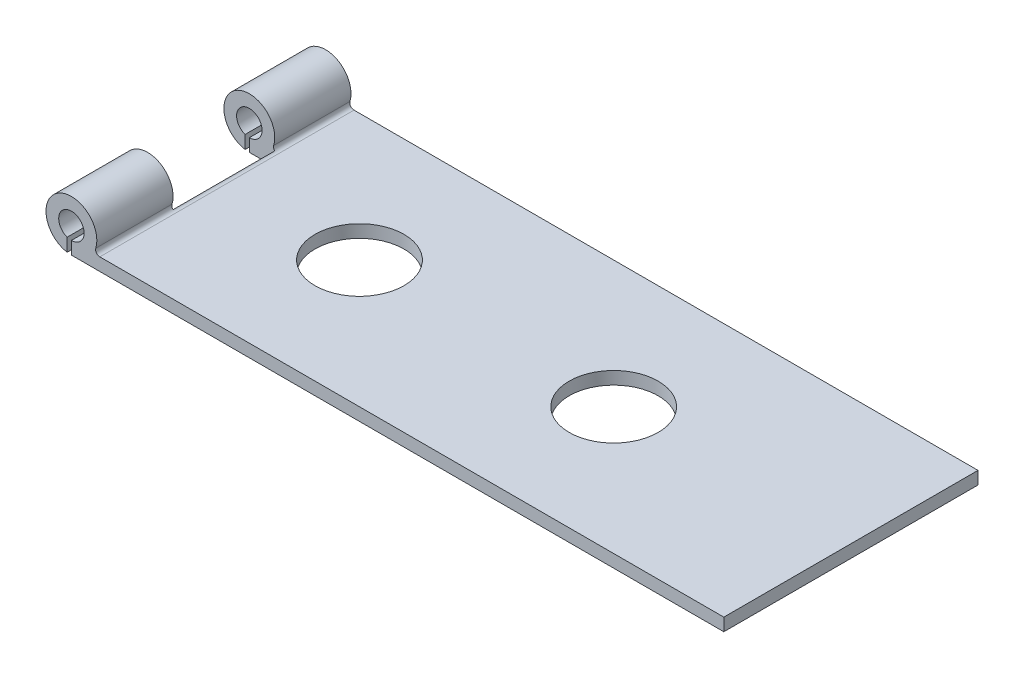
ISO-10303-21;
HEADER;
FILE_DESCRIPTION(('STEP AP214'),'2;1');
FILE_NAME('part.step','',(''),(''),'','','');
FILE_SCHEMA(('AUTOMOTIVE_DESIGN { 1 0 10303 214 1 1 1 1 }'));
ENDSEC;
DATA;
#1=APPLICATION_CONTEXT('core data for automotive mechanical design processes');
#2=APPLICATION_PROTOCOL_DEFINITION('international standard','automotive_design',2000,#1);
#3=PRODUCT_CONTEXT('',#1,'mechanical');
#4=PRODUCT('Part','Part','',(#3));
#5=PRODUCT_RELATED_PRODUCT_CATEGORY('part','',(#4));
#6=PRODUCT_DEFINITION_FORMATION('','',#4);
#7=PRODUCT_DEFINITION_CONTEXT('part definition',#1,'design');
#8=PRODUCT_DEFINITION('design','',#6,#7);
#9=PRODUCT_DEFINITION_SHAPE('','',#8);
#10=(LENGTH_UNIT() NAMED_UNIT(*) SI_UNIT(.MILLI.,.METRE.));
#11=(NAMED_UNIT(*) PLANE_ANGLE_UNIT() SI_UNIT($,.RADIAN.));
#12=(NAMED_UNIT(*) SI_UNIT($,.STERADIAN.) SOLID_ANGLE_UNIT());
#13=UNCERTAINTY_MEASURE_WITH_UNIT(LENGTH_MEASURE(1.E-05),#10,'distance_accuracy_value','');
#14=(GEOMETRIC_REPRESENTATION_CONTEXT(3) GLOBAL_UNCERTAINTY_ASSIGNED_CONTEXT((#13)) GLOBAL_UNIT_ASSIGNED_CONTEXT((#10,
#11,#12)) REPRESENTATION_CONTEXT('',''));
#15=CARTESIAN_POINT('',(0.,0.,0.));
#16=DIRECTION('',(0.,0.,1.));
#17=DIRECTION('',(1.,0.,0.));
#18=AXIS2_PLACEMENT_3D('',#15,#16,#17);
#19=CARTESIAN_POINT('',(0.,0.,15.));
#20=DIRECTION('',(0.,0.,-1.));
#21=DIRECTION('',(-1.,0.,0.));
#22=AXIS2_PLACEMENT_3D('',#19,#20,#21);
#23=CYLINDRICAL_SURFACE('',#22,3.);
#24=CARTESIAN_POINT('',(0.,0.,6.));
#25=DIRECTION('',(0.,0.,1.));
#26=DIRECTION('',(1.,0.,0.));
#27=AXIS2_PLACEMENT_3D('',#24,#25,#26);
#28=CIRCLE('',#27,3.);
#29=CARTESIAN_POINT('',(2.87494454249973,-0.857142857142859,6.));
#30=VERTEX_POINT('',#29);
#31=CARTESIAN_POINT('',(-0.5,-2.95803989154981,6.));
#32=VERTEX_POINT('',#31);
#33=EDGE_CURVE('E179',#30,#32,#28,.T.);
#34=ORIENTED_EDGE('',*,*,#33,.T.);
#35=DIRECTION('',(0.,0.,-1.));
#36=VECTOR('',#35,1.);
#37=CARTESIAN_POINT('',(-0.5,-2.95803989154981,15.));
#38=LINE('',#37,#36);
#39=CARTESIAN_POINT('',(-0.5,-2.95803989154981,15.));
#40=VERTEX_POINT('',#39);
#41=EDGE_CURVE('E56',#32,#40,#38,.F.);
#42=ORIENTED_EDGE('',*,*,#41,.T.);
#43=CARTESIAN_POINT('',(0.,0.,15.));
#44=DIRECTION('',(0.,0.,1.));
#45=DIRECTION('',(1.,0.,0.));
#46=AXIS2_PLACEMENT_3D('',#43,#44,#45);
#47=CIRCLE('',#46,3.);
#48=CARTESIAN_POINT('',(2.87494454249973,-0.857142857142859,15.));
#49=VERTEX_POINT('',#48);
#50=EDGE_CURVE('E185',#49,#40,#47,.T.);
#51=ORIENTED_EDGE('',*,*,#50,.F.);
#52=DIRECTION('',(0.,0.,-1.));
#53=VECTOR('',#52,1.);
#54=CARTESIAN_POINT('',(2.87494454249973,-0.857142857142859,15.));
#55=LINE('',#54,#53);
#56=EDGE_CURVE('E218',#49,#30,#55,.T.);
#57=ORIENTED_EDGE('',*,*,#56,.T.);
#58=EDGE_LOOP('',(#34,#42,#51,#57));
#59=FACE_BOUND('',#58,.T.);
#60=ADVANCED_FACE('F39',(#59),#23,.T.);
#61=CARTESIAN_POINT('',(0.,0.,15.));
#62=DIRECTION('',(0.,0.,-1.));
#63=DIRECTION('',(-1.,0.,0.));
#64=AXIS2_PLACEMENT_3D('',#61,#62,#63);
#65=CYLINDRICAL_SURFACE('',#64,1.5);
#66=DIRECTION('',(0.,0.,-1.));
#67=VECTOR('',#66,1.);
#68=CARTESIAN_POINT('',(0.,-1.5,15.));
#69=LINE('',#68,#67);
#70=CARTESIAN_POINT('',(0.,-1.5,15.));
#71=VERTEX_POINT('',#70);
#72=CARTESIAN_POINT('',(0.,-1.5,6.));
#73=VERTEX_POINT('',#72);
#74=EDGE_CURVE('E64',#71,#73,#69,.T.);
#75=ORIENTED_EDGE('',*,*,#74,.F.);
#76=CARTESIAN_POINT('',(0.,0.,15.));
#77=DIRECTION('',(0.,0.,1.));
#78=DIRECTION('',(1.,0.,0.));
#79=AXIS2_PLACEMENT_3D('',#76,#77,#78);
#80=CIRCLE('',#79,1.5);
#81=CARTESIAN_POINT('',(-0.5,-1.4142135623731,15.));
#82=VERTEX_POINT('',#81);
#83=EDGE_CURVE('E172',#71,#82,#80,.T.);
#84=ORIENTED_EDGE('',*,*,#83,.T.);
#85=DIRECTION('',(0.,0.,-1.));
#86=VECTOR('',#85,1.);
#87=CARTESIAN_POINT('',(-0.5,-1.4142135623731,15.));
#88=LINE('',#87,#86);
#89=CARTESIAN_POINT('',(-0.5,-1.4142135623731,6.));
#90=VERTEX_POINT('',#89);
#91=EDGE_CURVE('E247',#90,#82,#88,.F.);
#92=ORIENTED_EDGE('',*,*,#91,.F.);
#93=CARTESIAN_POINT('',(0.,0.,6.));
#94=DIRECTION('',(0.,0.,1.));
#95=DIRECTION('',(1.,0.,0.));
#96=AXIS2_PLACEMENT_3D('',#93,#94,#95);
#97=CIRCLE('',#96,1.5);
#98=EDGE_CURVE('E224',#73,#90,#97,.T.);
#99=ORIENTED_EDGE('',*,*,#98,.F.);
#100=EDGE_LOOP('',(#75,#84,#92,#99));
#101=FACE_BOUND('',#100,.T.);
#102=ADVANCED_FACE('F316',(#101),#65,.F.);
#103=CARTESIAN_POINT('',(3.35410196624968,-1.,15.));
#104=DIRECTION('',(0.,0.,1.));
#105=DIRECTION('',(1.,0.,0.));
#106=AXIS2_PLACEMENT_3D('',#103,#104,#105);
#107=PLANE('',#106);
#108=DIRECTION('',(0.,1.,0.));
#109=VECTOR('',#108,1.);
#110=CARTESIAN_POINT('',(0.,-1.,15.));
#111=LINE('',#110,#109);
#112=CARTESIAN_POINT('',(0.,-3.,15.));
#113=VERTEX_POINT('',#112);
#114=EDGE_CURVE('E256',#113,#71,#111,.T.);
#115=ORIENTED_EDGE('',*,*,#114,.F.);
#116=DIRECTION('',(1.,0.,0.));
#117=VECTOR('',#116,1.);
#118=CARTESIAN_POINT('',(0.,-3.,15.));
#119=LINE('',#118,#117);
#120=CARTESIAN_POINT('',(77.,-3.,15.));
#121=VERTEX_POINT('',#120);
#122=EDGE_CURVE('E189',#113,#121,#119,.T.);
#123=ORIENTED_EDGE('',*,*,#122,.T.);
#124=DIRECTION('',(0.,1.,0.));
#125=VECTOR('',#124,1.);
#126=CARTESIAN_POINT('',(77.,-3.,15.));
#127=LINE('',#126,#125);
#128=CARTESIAN_POINT('',(77.,-1.5,15.));
#129=VERTEX_POINT('',#128);
#130=EDGE_CURVE('E191',#121,#129,#127,.T.);
#131=ORIENTED_EDGE('',*,*,#130,.T.);
#132=DIRECTION('',(-1.,0.,0.));
#133=VECTOR('',#132,1.);
#134=CARTESIAN_POINT('',(3.35410196624968,-1.5,15.));
#135=LINE('',#134,#133);
#136=CARTESIAN_POINT('',(3.35410196624968,-1.5,15.));
#137=VERTEX_POINT('',#136);
#138=EDGE_CURVE('E193',#129,#137,#135,.T.);
#139=ORIENTED_EDGE('',*,*,#138,.T.);
#140=CARTESIAN_POINT('',(3.35410196624968,-1.,15.));
#141=DIRECTION('',(0.,0.,-1.));
#142=DIRECTION('',(1.,0.,0.));
#143=AXIS2_PLACEMENT_3D('',#140,#141,#142);
#144=CIRCLE('',#143,0.5);
#145=EDGE_CURVE('E182',#137,#49,#144,.T.);
#146=ORIENTED_EDGE('',*,*,#145,.T.);
#147=ORIENTED_EDGE('',*,*,#50,.T.);
#148=DIRECTION('',(0.,-1.,0.));
#149=VECTOR('',#148,1.);
#150=CARTESIAN_POINT('',(-0.5,-1.,15.));
#151=LINE('',#150,#149);
#152=EDGE_CURVE('E250',#82,#40,#151,.T.);
#153=ORIENTED_EDGE('',*,*,#152,.F.);
#154=ORIENTED_EDGE('',*,*,#83,.F.);
#155=EDGE_LOOP('',(#115,#123,#131,#139,#146,#147,#153,#154));
#156=FACE_BOUND('',#155,.T.);
#157=ADVANCED_FACE('F287',(#156),#107,.T.);
#158=CARTESIAN_POINT('',(3.35410196624968,-1.,-15.));
#159=DIRECTION('',(0.,0.,1.));
#160=DIRECTION('',(1.,0.,0.));
#161=AXIS2_PLACEMENT_3D('',#158,#159,#160);
#162=PLANE('',#161);
#163=DIRECTION('',(1.,0.,0.));
#164=VECTOR('',#163,1.);
#165=CARTESIAN_POINT('',(0.,-3.,-15.));
#166=LINE('',#165,#164);
#167=CARTESIAN_POINT('',(0.,-3.,-15.));
#168=VERTEX_POINT('',#167);
#169=CARTESIAN_POINT('',(77.,-3.,-15.));
#170=VERTEX_POINT('',#169);
#171=EDGE_CURVE('E200',#168,#170,#166,.T.);
#172=ORIENTED_EDGE('',*,*,#171,.F.);
#173=DIRECTION('',(0.,1.,0.));
#174=VECTOR('',#173,1.);
#175=CARTESIAN_POINT('',(0.,0.,-15.));
#176=LINE('',#175,#174);
#177=CARTESIAN_POINT('',(0.,-1.5,-15.));
#178=VERTEX_POINT('',#177);
#179=EDGE_CURVE('E158',#168,#178,#176,.T.);
#180=ORIENTED_EDGE('',*,*,#179,.T.);
#181=CARTESIAN_POINT('',(0.,0.,-15.));
#182=DIRECTION('',(0.,0.,1.));
#183=DIRECTION('',(1.,0.,0.));
#184=AXIS2_PLACEMENT_3D('',#181,#182,#183);
#185=CIRCLE('',#184,1.5);
#186=CARTESIAN_POINT('',(-0.5,-1.4142135623731,-15.));
#187=VERTEX_POINT('',#186);
#188=EDGE_CURVE('E165',#178,#187,#185,.T.);
#189=ORIENTED_EDGE('',*,*,#188,.T.);
#190=DIRECTION('',(0.,-1.,0.));
#191=VECTOR('',#190,1.);
#192=CARTESIAN_POINT('',(-0.5,0.,-15.));
#193=LINE('',#192,#191);
#194=CARTESIAN_POINT('',(-0.5,-2.95803989154981,-15.));
#195=VERTEX_POINT('',#194);
#196=EDGE_CURVE('E147',#187,#195,#193,.T.);
#197=ORIENTED_EDGE('',*,*,#196,.T.);
#198=CARTESIAN_POINT('',(0.,0.,-15.));
#199=DIRECTION('',(0.,0.,1.));
#200=DIRECTION('',(1.,0.,0.));
#201=AXIS2_PLACEMENT_3D('',#198,#199,#200);
#202=CIRCLE('',#201,3.);
#203=CARTESIAN_POINT('',(2.87494454249973,-0.857142857142859,-15.));
#204=VERTEX_POINT('',#203);
#205=EDGE_CURVE('E198',#204,#195,#202,.T.);
#206=ORIENTED_EDGE('',*,*,#205,.F.);
#207=CARTESIAN_POINT('',(3.35410196624968,-1.,-15.));
#208=DIRECTION('',(0.,0.,-1.));
#209=DIRECTION('',(1.,0.,0.));
#210=AXIS2_PLACEMENT_3D('',#207,#208,#209);
#211=CIRCLE('',#210,0.5);
#212=CARTESIAN_POINT('',(3.35410196624968,-1.5,-15.));
#213=VERTEX_POINT('',#212);
#214=EDGE_CURVE('E176',#213,#204,#211,.T.);
#215=ORIENTED_EDGE('',*,*,#214,.F.);
#216=DIRECTION('',(-1.,0.,0.));
#217=VECTOR('',#216,1.);
#218=CARTESIAN_POINT('',(3.35410196624968,-1.5,-15.));
#219=LINE('',#218,#217);
#220=CARTESIAN_POINT('',(77.,-1.5,-15.));
#221=VERTEX_POINT('',#220);
#222=EDGE_CURVE('E186',#221,#213,#219,.T.);
#223=ORIENTED_EDGE('',*,*,#222,.F.);
#224=DIRECTION('',(0.,1.,0.));
#225=VECTOR('',#224,1.);
#226=CARTESIAN_POINT('',(77.,-3.,-15.));
#227=LINE('',#226,#225);
#228=EDGE_CURVE('E202',#170,#221,#227,.T.);
#229=ORIENTED_EDGE('',*,*,#228,.F.);
#230=EDGE_LOOP('',(#172,#180,#189,#197,#206,#215,#223,#229));
#231=FACE_BOUND('',#230,.T.);
#232=ADVANCED_FACE('F171',(#231),#162,.F.);
#233=CARTESIAN_POINT('',(3.35410196624968,-1.,15.));
#234=DIRECTION('',(0.,0.,-1.));
#235=DIRECTION('',(-1.,0.,0.));
#236=AXIS2_PLACEMENT_3D('',#233,#234,#235);
#237=CYLINDRICAL_SURFACE('',#236,0.5);
#238=DIRECTION('',(0.,0.,-1.));
#239=VECTOR('',#238,1.);
#240=CARTESIAN_POINT('',(3.,-1.35300396243967,15.));
#241=LINE('',#240,#239);
#242=CARTESIAN_POINT('',(3.,-1.35300396243967,-6.));
#243=VERTEX_POINT('',#242);
#244=CARTESIAN_POINT('',(3.,-1.35300396243967,6.));
#245=VERTEX_POINT('',#244);
#246=EDGE_CURVE('E173',#243,#245,#241,.F.);
#247=ORIENTED_EDGE('',*,*,#246,.T.);
#248=CARTESIAN_POINT('',(3.35410196624968,-1.,6.));
#249=DIRECTION('',(0.,0.,1.));
#250=DIRECTION('',(1.,0.,0.));
#251=AXIS2_PLACEMENT_3D('',#248,#249,#250);
#252=CIRCLE('',#251,0.5);
#253=EDGE_CURVE('E227',#245,#30,#252,.F.);
#254=ORIENTED_EDGE('',*,*,#253,.T.);
#255=ORIENTED_EDGE('',*,*,#56,.F.);
#256=ORIENTED_EDGE('',*,*,#145,.F.);
#257=DIRECTION('',(0.,0.,-1.));
#258=VECTOR('',#257,1.);
#259=CARTESIAN_POINT('',(3.35410196624968,-1.5,15.));
#260=LINE('',#259,#258);
#261=EDGE_CURVE('E195',#137,#213,#260,.T.);
#262=ORIENTED_EDGE('',*,*,#261,.T.);
#263=ORIENTED_EDGE('',*,*,#214,.T.);
#264=CARTESIAN_POINT('',(2.87494454249973,-0.857142857142859,-6.));
#265=VERTEX_POINT('',#264);
#266=EDGE_CURVE('E217',#265,#204,#55,.T.);
#267=ORIENTED_EDGE('',*,*,#266,.F.);
#268=CARTESIAN_POINT('',(3.35410196624968,-1.,-6.));
#269=DIRECTION('',(0.,0.,-1.));
#270=DIRECTION('',(-1.,0.,0.));
#271=AXIS2_PLACEMENT_3D('',#268,#269,#270);
#272=CIRCLE('',#271,0.5);
#273=EDGE_CURVE('E228',#265,#243,#272,.F.);
#274=ORIENTED_EDGE('',*,*,#273,.T.);
#275=EDGE_LOOP('',(#247,#254,#255,#256,#262,#263,#267,#274));
#276=FACE_BOUND('',#275,.T.);
#277=ADVANCED_FACE('F41',(#276),#237,.F.);
#278=ORIENTED_EDGE('',*,*,#205,.T.);
#279=DIRECTION('',(0.,0.,-1.));
#280=VECTOR('',#279,1.);
#281=CARTESIAN_POINT('',(-0.5,-2.95803989154981,15.));
#282=LINE('',#281,#280);
#283=CARTESIAN_POINT('',(-0.5,-2.95803989154981,-6.));
#284=VERTEX_POINT('',#283);
#285=EDGE_CURVE('E153',#195,#284,#282,.F.);
#286=ORIENTED_EDGE('',*,*,#285,.T.);
#287=CARTESIAN_POINT('',(0.,0.,-6.));
#288=DIRECTION('',(0.,0.,-1.));
#289=DIRECTION('',(-1.,0.,0.));
#290=AXIS2_PLACEMENT_3D('',#287,#288,#289);
#291=CIRCLE('',#290,3.);
#292=EDGE_CURVE('E222',#284,#265,#291,.T.);
#293=ORIENTED_EDGE('',*,*,#292,.T.);
#294=ORIENTED_EDGE('',*,*,#266,.T.);
#295=EDGE_LOOP('',(#278,#286,#293,#294));
#296=FACE_BOUND('',#295,.T.);
#297=ADVANCED_FACE('F296',(#296),#23,.T.);
#298=CARTESIAN_POINT('',(0.,-3.,15.));
#299=DIRECTION('',(0.,1.,0.));
#300=DIRECTION('',(0.,0.,1.));
#301=AXIS2_PLACEMENT_3D('',#298,#299,#300);
#302=PLANE('',#301);
#303=CARTESIAN_POINT('',(19.,-3.,0.));
#304=DIRECTION('',(0.,1.,0.));
#305=DIRECTION('',(0.,0.,1.));
#306=AXIS2_PLACEMENT_3D('',#303,#304,#305);
#307=CIRCLE('',#306,5.25);
#308=CARTESIAN_POINT('',(19.,-3.,5.25));
#309=VERTEX_POINT('',#308);
#310=EDGE_CURVE('E231',#309,#309,#307,.T.);
#311=ORIENTED_EDGE('',*,*,#310,.T.);
#312=EDGE_LOOP('',(#311));
#313=FACE_BOUND('',#312,.T.);
#314=CARTESIAN_POINT('',(49.,-3.,0.));
#315=DIRECTION('',(0.,1.,0.));
#316=DIRECTION('',(0.,0.,1.));
#317=AXIS2_PLACEMENT_3D('',#314,#315,#316);
#318=CIRCLE('',#317,5.25);
#319=CARTESIAN_POINT('',(49.,-3.,5.25));
#320=VERTEX_POINT('',#319);
#321=EDGE_CURVE('E236',#320,#320,#318,.T.);
#322=ORIENTED_EDGE('',*,*,#321,.T.);
#323=EDGE_LOOP('',(#322));
#324=FACE_BOUND('',#323,.T.);
#325=DIRECTION('',(0.,0.,-1.));
#326=VECTOR('',#325,1.);
#327=CARTESIAN_POINT('',(0.,-3.,15.));
#328=LINE('',#327,#326);
#329=CARTESIAN_POINT('',(0.,-3.,6.));
#330=VERTEX_POINT('',#329);
#331=EDGE_CURVE('E214',#113,#330,#328,.T.);
#332=ORIENTED_EDGE('',*,*,#331,.T.);
#333=DIRECTION('',(1.,0.,0.));
#334=VECTOR('',#333,1.);
#335=CARTESIAN_POINT('',(-3.,-3.,6.));
#336=LINE('',#335,#334);
#337=CARTESIAN_POINT('',(3.,-3.,6.));
#338=VERTEX_POINT('',#337);
#339=EDGE_CURVE('E265',#330,#338,#336,.T.);
#340=ORIENTED_EDGE('',*,*,#339,.T.);
#341=DIRECTION('',(0.,0.,-1.));
#342=VECTOR('',#341,1.);
#343=CARTESIAN_POINT('',(3.,-3.,6.));
#344=LINE('',#343,#342);
#345=CARTESIAN_POINT('',(3.,-3.,-6.));
#346=VERTEX_POINT('',#345);
#347=EDGE_CURVE('E259',#338,#346,#344,.T.);
#348=ORIENTED_EDGE('',*,*,#347,.T.);
#349=DIRECTION('',(-1.,0.,0.));
#350=VECTOR('',#349,1.);
#351=CARTESIAN_POINT('',(-3.,-3.,-6.));
#352=LINE('',#351,#350);
#353=CARTESIAN_POINT('',(0.,-3.,-6.));
#354=VERTEX_POINT('',#353);
#355=EDGE_CURVE('E262',#346,#354,#352,.T.);
#356=ORIENTED_EDGE('',*,*,#355,.T.);
#357=EDGE_CURVE('E213',#354,#168,#328,.T.);
#358=ORIENTED_EDGE('',*,*,#357,.T.);
#359=ORIENTED_EDGE('',*,*,#171,.T.);
#360=DIRECTION('',(0.,0.,-1.));
#361=VECTOR('',#360,1.);
#362=CARTESIAN_POINT('',(77.,-3.,15.));
#363=LINE('',#362,#361);
#364=EDGE_CURVE('E210',#121,#170,#363,.T.);
#365=ORIENTED_EDGE('',*,*,#364,.F.);
#366=ORIENTED_EDGE('',*,*,#122,.F.);
#367=EDGE_LOOP('',(#332,#340,#348,#356,#358,#359,#365,#366));
#368=FACE_BOUND('',#367,.T.);
#369=ADVANCED_FACE('F310',(#313,#324,#368),#302,.F.);
#370=CARTESIAN_POINT('',(77.,-3.,15.));
#371=DIRECTION('',(-1.,0.,0.));
#372=DIRECTION('',(0.,0.,1.));
#373=AXIS2_PLACEMENT_3D('',#370,#371,#372);
#374=PLANE('',#373);
#375=ORIENTED_EDGE('',*,*,#228,.T.);
#376=DIRECTION('',(0.,0.,-1.));
#377=VECTOR('',#376,1.);
#378=CARTESIAN_POINT('',(77.,-1.5,15.));
#379=LINE('',#378,#377);
#380=EDGE_CURVE('E207',#129,#221,#379,.T.);
#381=ORIENTED_EDGE('',*,*,#380,.F.);
#382=ORIENTED_EDGE('',*,*,#130,.F.);
#383=ORIENTED_EDGE('',*,*,#364,.T.);
#384=EDGE_LOOP('',(#375,#381,#382,#383));
#385=FACE_BOUND('',#384,.T.);
#386=ADVANCED_FACE('F343',(#385),#374,.F.);
#387=CARTESIAN_POINT('',(3.35410196624968,-1.5,15.));
#388=DIRECTION('',(0.,-1.,0.));
#389=DIRECTION('',(0.,0.,-1.));
#390=AXIS2_PLACEMENT_3D('',#387,#388,#389);
#391=PLANE('',#390);
#392=CARTESIAN_POINT('',(19.,-1.5,0.));
#393=DIRECTION('',(0.,-1.,0.));
#394=DIRECTION('',(0.,0.,-1.));
#395=AXIS2_PLACEMENT_3D('',#392,#393,#394);
#396=CIRCLE('',#395,5.25);
#397=CARTESIAN_POINT('',(19.,-1.5,-5.25));
#398=VERTEX_POINT('',#397);
#399=EDGE_CURVE('E43',#398,#398,#396,.T.);
#400=ORIENTED_EDGE('',*,*,#399,.T.);
#401=EDGE_LOOP('',(#400));
#402=FACE_BOUND('',#401,.T.);
#403=CARTESIAN_POINT('',(49.,-1.5,0.));
#404=DIRECTION('',(0.,-1.,0.));
#405=DIRECTION('',(0.,0.,-1.));
#406=AXIS2_PLACEMENT_3D('',#403,#404,#405);
#407=CIRCLE('',#406,5.25);
#408=CARTESIAN_POINT('',(49.,-1.5,-5.25));
#409=VERTEX_POINT('',#408);
#410=EDGE_CURVE('E229',#409,#409,#407,.T.);
#411=ORIENTED_EDGE('',*,*,#410,.T.);
#412=EDGE_LOOP('',(#411));
#413=FACE_BOUND('',#412,.T.);
#414=ORIENTED_EDGE('',*,*,#222,.T.);
#415=ORIENTED_EDGE('',*,*,#261,.F.);
#416=ORIENTED_EDGE('',*,*,#138,.F.);
#417=ORIENTED_EDGE('',*,*,#380,.T.);
#418=EDGE_LOOP('',(#414,#415,#416,#417));
#419=FACE_BOUND('',#418,.T.);
#420=ADVANCED_FACE('F354',(#402,#413,#419),#391,.F.);
#421=DIRECTION('',(0.,0.,-1.));
#422=VECTOR('',#421,1.);
#423=CARTESIAN_POINT('',(0.,-1.5,15.));
#424=LINE('',#423,#422);
#425=CARTESIAN_POINT('',(0.,-1.5,-6.));
#426=VERTEX_POINT('',#425);
#427=EDGE_CURVE('E252',#426,#178,#424,.T.);
#428=ORIENTED_EDGE('',*,*,#427,.F.);
#429=CARTESIAN_POINT('',(0.,0.,-6.));
#430=DIRECTION('',(0.,0.,-1.));
#431=DIRECTION('',(-1.,0.,0.));
#432=AXIS2_PLACEMENT_3D('',#429,#430,#431);
#433=CIRCLE('',#432,1.5);
#434=CARTESIAN_POINT('',(-0.5,-1.4142135623731,-6.));
#435=VERTEX_POINT('',#434);
#436=EDGE_CURVE('E167',#435,#426,#433,.T.);
#437=ORIENTED_EDGE('',*,*,#436,.F.);
#438=DIRECTION('',(0.,0.,-1.));
#439=VECTOR('',#438,1.);
#440=CARTESIAN_POINT('',(-0.5,-1.4142135623731,15.));
#441=LINE('',#440,#439);
#442=EDGE_CURVE('E150',#187,#435,#441,.F.);
#443=ORIENTED_EDGE('',*,*,#442,.F.);
#444=ORIENTED_EDGE('',*,*,#188,.F.);
#445=EDGE_LOOP('',(#428,#437,#443,#444));
#446=FACE_BOUND('',#445,.T.);
#447=ADVANCED_FACE('F164',(#446),#65,.F.);
#448=CARTESIAN_POINT('',(3.,-3.,6.));
#449=DIRECTION('',(1.,0.,0.));
#450=DIRECTION('',(0.,0.,-1.));
#451=AXIS2_PLACEMENT_3D('',#448,#449,#450);
#452=PLANE('',#451);
#453=DIRECTION('',(0.,1.,0.));
#454=VECTOR('',#453,1.);
#455=CARTESIAN_POINT('',(3.,-3.,-6.));
#456=LINE('',#455,#454);
#457=EDGE_CURVE('E268',#346,#243,#456,.T.);
#458=ORIENTED_EDGE('',*,*,#457,.F.);
#459=ORIENTED_EDGE('',*,*,#347,.F.);
#460=DIRECTION('',(0.,1.,0.));
#461=VECTOR('',#460,1.);
#462=CARTESIAN_POINT('',(3.,-3.,6.));
#463=LINE('',#462,#461);
#464=EDGE_CURVE('E223',#338,#245,#463,.T.);
#465=ORIENTED_EDGE('',*,*,#464,.T.);
#466=ORIENTED_EDGE('',*,*,#246,.F.);
#467=EDGE_LOOP('',(#458,#459,#465,#466));
#468=FACE_BOUND('',#467,.T.);
#469=ADVANCED_FACE('F304',(#468),#452,.F.);
#470=CARTESIAN_POINT('',(-3.,-3.,6.));
#471=DIRECTION('',(0.,0.,1.));
#472=DIRECTION('',(1.,0.,0.));
#473=AXIS2_PLACEMENT_3D('',#470,#471,#472);
#474=PLANE('',#473);
#475=ORIENTED_EDGE('',*,*,#339,.F.);
#476=DIRECTION('',(0.,1.,0.));
#477=VECTOR('',#476,1.);
#478=CARTESIAN_POINT('',(0.,-3.,6.));
#479=LINE('',#478,#477);
#480=EDGE_CURVE('E254',#330,#73,#479,.T.);
#481=ORIENTED_EDGE('',*,*,#480,.T.);
#482=ORIENTED_EDGE('',*,*,#98,.T.);
#483=DIRECTION('',(0.,-1.,0.));
#484=VECTOR('',#483,1.);
#485=CARTESIAN_POINT('',(-0.5,-3.,6.));
#486=LINE('',#485,#484);
#487=EDGE_CURVE('E245',#90,#32,#486,.T.);
#488=ORIENTED_EDGE('',*,*,#487,.T.);
#489=ORIENTED_EDGE('',*,*,#33,.F.);
#490=ORIENTED_EDGE('',*,*,#253,.F.);
#491=ORIENTED_EDGE('',*,*,#464,.F.);
#492=EDGE_LOOP('',(#475,#481,#482,#488,#489,#490,#491));
#493=FACE_BOUND('',#492,.T.);
#494=ADVANCED_FACE('F306',(#493),#474,.F.);
#495=CARTESIAN_POINT('',(-3.,-3.,-6.));
#496=DIRECTION('',(0.,0.,-1.));
#497=DIRECTION('',(-1.,0.,0.));
#498=AXIS2_PLACEMENT_3D('',#495,#496,#497);
#499=PLANE('',#498);
#500=ORIENTED_EDGE('',*,*,#436,.T.);
#501=DIRECTION('',(0.,-1.,0.));
#502=VECTOR('',#501,1.);
#503=CARTESIAN_POINT('',(0.,-3.,-6.));
#504=LINE('',#503,#502);
#505=EDGE_CURVE('E11',#426,#354,#504,.T.);
#506=ORIENTED_EDGE('',*,*,#505,.T.);
#507=ORIENTED_EDGE('',*,*,#355,.F.);
#508=ORIENTED_EDGE('',*,*,#457,.T.);
#509=ORIENTED_EDGE('',*,*,#273,.F.);
#510=ORIENTED_EDGE('',*,*,#292,.F.);
#511=DIRECTION('',(0.,1.,0.));
#512=VECTOR('',#511,1.);
#513=CARTESIAN_POINT('',(-0.5,-3.,-6.));
#514=LINE('',#513,#512);
#515=EDGE_CURVE('E48',#284,#435,#514,.T.);
#516=ORIENTED_EDGE('',*,*,#515,.T.);
#517=EDGE_LOOP('',(#500,#506,#507,#508,#509,#510,#516));
#518=FACE_BOUND('',#517,.T.);
#519=ADVANCED_FACE('F300',(#518),#499,.F.);
#520=CARTESIAN_POINT('',(-0.5,0.,-15.));
#521=DIRECTION('',(-1.,0.,0.));
#522=DIRECTION('',(0.,0.,1.));
#523=AXIS2_PLACEMENT_3D('',#520,#521,#522);
#524=PLANE('',#523);
#525=ORIENTED_EDGE('',*,*,#196,.F.);
#526=ORIENTED_EDGE('',*,*,#442,.T.);
#527=ORIENTED_EDGE('',*,*,#515,.F.);
#528=ORIENTED_EDGE('',*,*,#285,.F.);
#529=EDGE_LOOP('',(#525,#526,#527,#528));
#530=FACE_BOUND('',#529,.T.);
#531=ADVANCED_FACE('F149',(#530),#524,.F.);
#532=CARTESIAN_POINT('',(0.,0.,-15.));
#533=DIRECTION('',(1.,0.,0.));
#534=DIRECTION('',(0.,0.,-1.));
#535=AXIS2_PLACEMENT_3D('',#532,#533,#534);
#536=PLANE('',#535);
#537=ORIENTED_EDGE('',*,*,#505,.F.);
#538=ORIENTED_EDGE('',*,*,#427,.T.);
#539=ORIENTED_EDGE('',*,*,#179,.F.);
#540=ORIENTED_EDGE('',*,*,#357,.F.);
#541=EDGE_LOOP('',(#537,#538,#539,#540));
#542=FACE_BOUND('',#541,.T.);
#543=ADVANCED_FACE('F319',(#542),#536,.F.);
#544=ORIENTED_EDGE('',*,*,#152,.T.);
#545=ORIENTED_EDGE('',*,*,#41,.F.);
#546=ORIENTED_EDGE('',*,*,#487,.F.);
#547=ORIENTED_EDGE('',*,*,#91,.T.);
#548=EDGE_LOOP('',(#544,#545,#546,#547));
#549=FACE_BOUND('',#548,.T.);
#550=ADVANCED_FACE('F317',(#549),#524,.F.);
#551=ORIENTED_EDGE('',*,*,#74,.T.);
#552=ORIENTED_EDGE('',*,*,#480,.F.);
#553=ORIENTED_EDGE('',*,*,#331,.F.);
#554=ORIENTED_EDGE('',*,*,#114,.T.);
#555=EDGE_LOOP('',(#551,#552,#553,#554));
#556=FACE_BOUND('',#555,.T.);
#557=ADVANCED_FACE('F312',(#556),#536,.F.);
#558=CARTESIAN_POINT('',(49.,-3.,0.));
#559=DIRECTION('',(0.,1.,0.));
#560=DIRECTION('',(0.,0.,1.));
#561=AXIS2_PLACEMENT_3D('',#558,#559,#560);
#562=CYLINDRICAL_SURFACE('',#561,5.25);
#563=ORIENTED_EDGE('',*,*,#321,.F.);
#564=EDGE_LOOP('',(#563));
#565=FACE_BOUND('',#564,.T.);
#566=ORIENTED_EDGE('',*,*,#410,.F.);
#567=EDGE_LOOP('',(#566));
#568=FACE_BOUND('',#567,.T.);
#569=ADVANCED_FACE('F325',(#565,#568),#562,.F.);
#570=CARTESIAN_POINT('',(19.,-3.,0.));
#571=DIRECTION('',(0.,1.,0.));
#572=DIRECTION('',(0.,0.,1.));
#573=AXIS2_PLACEMENT_3D('',#570,#571,#572);
#574=CYLINDRICAL_SURFACE('',#573,5.25);
#575=ORIENTED_EDGE('',*,*,#310,.F.);
#576=EDGE_LOOP('',(#575));
#577=FACE_BOUND('',#576,.T.);
#578=ORIENTED_EDGE('',*,*,#399,.F.);
#579=EDGE_LOOP('',(#578));
#580=FACE_BOUND('',#579,.T.);
#581=ADVANCED_FACE('F444',(#577,#580),#574,.F.);
#582=CLOSED_SHELL('',(#60,#102,#157,#232,#277,#297,#369,#386,#420,#447,#469,#494,#519,#531,#543,
#550,#557,#569,#581));
#583=MANIFOLD_SOLID_BREP('B2',#582);
#584=ADVANCED_BREP_SHAPE_REPRESENTATION('',(#18,#583),#14);
#585=SHAPE_DEFINITION_REPRESENTATION(#9,#584);
ENDSEC;
END-ISO-10303-21;
